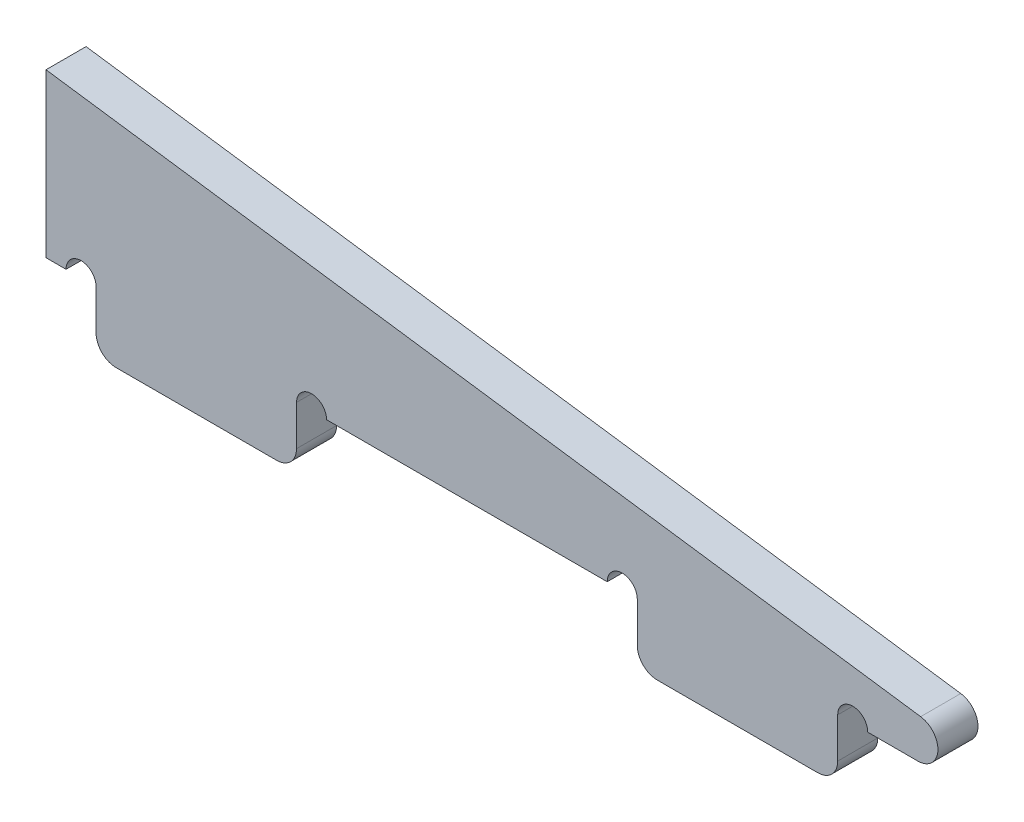
ISO-10303-21;
HEADER;
FILE_DESCRIPTION(('STEP AP214'),'2;1');
FILE_NAME('part.step','',(''),(''),'','','');
FILE_SCHEMA(('AUTOMOTIVE_DESIGN { 1 0 10303 214 1 1 1 1 }'));
ENDSEC;
DATA;
#1=APPLICATION_CONTEXT('core data for automotive mechanical design processes');
#2=APPLICATION_PROTOCOL_DEFINITION('international standard','automotive_design',2000,#1);
#3=PRODUCT_CONTEXT('',#1,'mechanical');
#4=PRODUCT('Part','Part','',(#3));
#5=PRODUCT_RELATED_PRODUCT_CATEGORY('part','',(#4));
#6=PRODUCT_DEFINITION_FORMATION('','',#4);
#7=PRODUCT_DEFINITION_CONTEXT('part definition',#1,'design');
#8=PRODUCT_DEFINITION('design','',#6,#7);
#9=PRODUCT_DEFINITION_SHAPE('','',#8);
#10=(LENGTH_UNIT() NAMED_UNIT(*) SI_UNIT(.MILLI.,.METRE.));
#11=(NAMED_UNIT(*) PLANE_ANGLE_UNIT() SI_UNIT($,.RADIAN.));
#12=(NAMED_UNIT(*) SI_UNIT($,.STERADIAN.) SOLID_ANGLE_UNIT());
#13=UNCERTAINTY_MEASURE_WITH_UNIT(LENGTH_MEASURE(1.E-05),#10,'distance_accuracy_value','');
#14=(GEOMETRIC_REPRESENTATION_CONTEXT(3) GLOBAL_UNCERTAINTY_ASSIGNED_CONTEXT((#13)) GLOBAL_UNIT_ASSIGNED_CONTEXT((#10,
#11,#12)) REPRESENTATION_CONTEXT('',''));
#15=CARTESIAN_POINT('',(0.,0.,0.));
#16=DIRECTION('',(0.,0.,1.));
#17=DIRECTION('',(1.,0.,0.));
#18=AXIS2_PLACEMENT_3D('',#15,#16,#17);
#19=CARTESIAN_POINT('',(0.,0.,2.));
#20=DIRECTION('',(0.,1.,0.));
#21=DIRECTION('',(0.,0.,1.));
#22=AXIS2_PLACEMENT_3D('',#19,#20,#21);
#23=PLANE('',#22);
#24=DIRECTION('',(1.,0.,0.));
#25=VECTOR('',#24,1.);
#26=CARTESIAN_POINT('',(0.,0.,2.));
#27=LINE('',#26,#25);
#28=CARTESIAN_POINT('',(1.5,0.,2.));
#29=VERTEX_POINT('',#28);
#30=CARTESIAN_POINT('',(4.,0.,2.));
#31=VERTEX_POINT('',#30);
#32=EDGE_CURVE('E208',#29,#31,#27,.T.);
#33=ORIENTED_EDGE('',*,*,#32,.F.);
#34=DIRECTION('',(0.,0.,1.));
#35=VECTOR('',#34,1.);
#36=CARTESIAN_POINT('',(1.5,0.,0.));
#37=LINE('',#36,#35);
#38=CARTESIAN_POINT('',(1.5,0.,0.));
#39=VERTEX_POINT('',#38);
#40=EDGE_CURVE('E193',#29,#39,#37,.F.);
#41=ORIENTED_EDGE('',*,*,#40,.T.);
#42=DIRECTION('',(1.,0.,0.));
#43=VECTOR('',#42,1.);
#44=CARTESIAN_POINT('',(0.,0.,0.));
#45=LINE('',#44,#43);
#46=CARTESIAN_POINT('',(4.,0.,0.));
#47=VERTEX_POINT('',#46);
#48=EDGE_CURVE('E206',#39,#47,#45,.T.);
#49=ORIENTED_EDGE('',*,*,#48,.T.);
#50=DIRECTION('',(0.,0.,-1.));
#51=VECTOR('',#50,1.);
#52=CARTESIAN_POINT('',(4.,0.,2.));
#53=LINE('',#52,#51);
#54=EDGE_CURVE('E270',#31,#47,#53,.T.);
#55=ORIENTED_EDGE('',*,*,#54,.F.);
#56=EDGE_LOOP('',(#33,#41,#49,#55));
#57=FACE_BOUND('',#56,.T.);
#58=ADVANCED_FACE('F50',(#57),#23,.F.);
#59=CARTESIAN_POINT('',(4.,1.,2.));
#60=DIRECTION('',(0.,0.,-1.));
#61=DIRECTION('',(-1.,0.,0.));
#62=AXIS2_PLACEMENT_3D('',#59,#60,#61);
#63=CYLINDRICAL_SURFACE('',#62,1.);
#64=CARTESIAN_POINT('',(4.,1.,0.));
#65=DIRECTION('',(0.,0.,1.));
#66=DIRECTION('',(1.,0.,0.));
#67=AXIS2_PLACEMENT_3D('',#64,#65,#66);
#68=CIRCLE('',#67,1.);
#69=CARTESIAN_POINT('',(4.13917310096006,1.99026806874157,0.));
#70=VERTEX_POINT('',#69);
#71=EDGE_CURVE('E214',#47,#70,#68,.T.);
#72=ORIENTED_EDGE('',*,*,#71,.T.);
#73=DIRECTION('',(0.,0.,-1.));
#74=VECTOR('',#73,1.);
#75=CARTESIAN_POINT('',(4.13917310096006,1.99026806874157,2.));
#76=LINE('',#75,#74);
#77=CARTESIAN_POINT('',(4.13917310096006,1.99026806874157,2.));
#78=VERTEX_POINT('',#77);
#79=EDGE_CURVE('E267',#78,#70,#76,.T.);
#80=ORIENTED_EDGE('',*,*,#79,.F.);
#81=CARTESIAN_POINT('',(4.,1.,2.));
#82=DIRECTION('',(0.,0.,1.));
#83=DIRECTION('',(1.,0.,0.));
#84=AXIS2_PLACEMENT_3D('',#81,#82,#83);
#85=CIRCLE('',#84,1.);
#86=EDGE_CURVE('E344',#31,#78,#85,.T.);
#87=ORIENTED_EDGE('',*,*,#86,.F.);
#88=ORIENTED_EDGE('',*,*,#54,.T.);
#89=EDGE_LOOP('',(#72,#80,#87,#88));
#90=FACE_BOUND('',#89,.T.);
#91=ADVANCED_FACE('F388',(#90),#63,.T.);
#92=CARTESIAN_POINT('',(4.13917310096006,1.99026806874157,2.));
#93=DIRECTION('',(-0.139173100960059,-0.990268068741571,0.));
#94=DIRECTION('',(0.990268068741571,-0.139173100960059,0.));
#95=AXIS2_PLACEMENT_3D('',#92,#93,#94);
#96=PLANE('',#95);
#97=DIRECTION('',(-0.990268068741571,0.139173100960058,0.));
#98=VECTOR('',#97,1.);
#99=CARTESIAN_POINT('',(4.13917310096006,1.99026806874157,0.));
#100=LINE('',#99,#98);
#101=CARTESIAN_POINT('',(-39.5,8.12335388207233,0.));
#102=VERTEX_POINT('',#101);
#103=EDGE_CURVE('E218',#70,#102,#100,.T.);
#104=ORIENTED_EDGE('',*,*,#103,.T.);
#105=DIRECTION('',(0.,0.,-1.));
#106=VECTOR('',#105,1.);
#107=CARTESIAN_POINT('',(-39.5,8.12335388207233,2.));
#108=LINE('',#107,#106);
#109=CARTESIAN_POINT('',(-39.5,8.12335388207233,2.));
#110=VERTEX_POINT('',#109);
#111=EDGE_CURVE('E264',#110,#102,#108,.T.);
#112=ORIENTED_EDGE('',*,*,#111,.F.);
#113=DIRECTION('',(-0.990268068741571,0.139173100960058,0.));
#114=VECTOR('',#113,1.);
#115=CARTESIAN_POINT('',(4.13917310096006,1.99026806874157,2.));
#116=LINE('',#115,#114);
#117=EDGE_CURVE('E346',#78,#110,#116,.T.);
#118=ORIENTED_EDGE('',*,*,#117,.F.);
#119=ORIENTED_EDGE('',*,*,#79,.T.);
#120=EDGE_LOOP('',(#104,#112,#118,#119));
#121=FACE_BOUND('',#120,.T.);
#122=ADVANCED_FACE('F392',(#121),#96,.F.);
#123=CARTESIAN_POINT('',(-39.5,8.12335388207233,2.));
#124=DIRECTION('',(1.,0.,0.));
#125=DIRECTION('',(0.,0.,-1.));
#126=AXIS2_PLACEMENT_3D('',#123,#124,#125);
#127=PLANE('',#126);
#128=DIRECTION('',(0.,-1.,0.));
#129=VECTOR('',#128,1.);
#130=CARTESIAN_POINT('',(-39.5,8.12335388207233,0.));
#131=LINE('',#130,#129);
#132=CARTESIAN_POINT('',(-39.5,0.,0.));
#133=VERTEX_POINT('',#132);
#134=EDGE_CURVE('E228',#102,#133,#131,.T.);
#135=ORIENTED_EDGE('',*,*,#134,.T.);
#136=DIRECTION('',(0.,0.,-1.));
#137=VECTOR('',#136,1.);
#138=CARTESIAN_POINT('',(-39.5,0.,2.));
#139=LINE('',#138,#137);
#140=CARTESIAN_POINT('',(-39.5,0.,2.));
#141=VERTEX_POINT('',#140);
#142=EDGE_CURVE('E261',#141,#133,#139,.T.);
#143=ORIENTED_EDGE('',*,*,#142,.F.);
#144=DIRECTION('',(0.,-1.,0.));
#145=VECTOR('',#144,1.);
#146=CARTESIAN_POINT('',(-39.5,8.12335388207233,2.));
#147=LINE('',#146,#145);
#148=EDGE_CURVE('E348',#110,#141,#147,.T.);
#149=ORIENTED_EDGE('',*,*,#148,.F.);
#150=ORIENTED_EDGE('',*,*,#111,.T.);
#151=EDGE_LOOP('',(#135,#143,#149,#150));
#152=FACE_BOUND('',#151,.T.);
#153=ADVANCED_FACE('F398',(#152),#127,.F.);
#154=CARTESIAN_POINT('',(-39.5,0.,2.));
#155=DIRECTION('',(0.,1.,0.));
#156=DIRECTION('',(0.,0.,1.));
#157=AXIS2_PLACEMENT_3D('',#154,#155,#156);
#158=PLANE('',#157);
#159=DIRECTION('',(1.,0.,0.));
#160=VECTOR('',#159,1.);
#161=CARTESIAN_POINT('',(-39.5,0.,0.));
#162=LINE('',#161,#160);
#163=CARTESIAN_POINT('',(-38.5,0.,0.));
#164=VERTEX_POINT('',#163);
#165=EDGE_CURVE('E230',#133,#164,#162,.T.);
#166=ORIENTED_EDGE('',*,*,#165,.T.);
#167=DIRECTION('',(0.,0.,1.));
#168=VECTOR('',#167,1.);
#169=CARTESIAN_POINT('',(-38.5,0.,0.));
#170=LINE('',#169,#168);
#171=CARTESIAN_POINT('',(-38.5,0.,2.));
#172=VERTEX_POINT('',#171);
#173=EDGE_CURVE('E216',#164,#172,#170,.T.);
#174=ORIENTED_EDGE('',*,*,#173,.T.);
#175=DIRECTION('',(1.,0.,0.));
#176=VECTOR('',#175,1.);
#177=CARTESIAN_POINT('',(-39.5,0.,2.));
#178=LINE('',#177,#176);
#179=EDGE_CURVE('E350',#141,#172,#178,.T.);
#180=ORIENTED_EDGE('',*,*,#179,.F.);
#181=ORIENTED_EDGE('',*,*,#142,.T.);
#182=EDGE_LOOP('',(#166,#174,#180,#181));
#183=FACE_BOUND('',#182,.T.);
#184=ADVANCED_FACE('F402',(#183),#158,.F.);
#185=CARTESIAN_POINT('',(-37.,0.,2.));
#186=DIRECTION('',(1.,0.,0.));
#187=DIRECTION('',(0.,0.,-1.));
#188=AXIS2_PLACEMENT_3D('',#185,#186,#187);
#189=PLANE('',#188);
#190=DIRECTION('',(0.,-1.,0.));
#191=VECTOR('',#190,1.);
#192=CARTESIAN_POINT('',(-37.,0.,0.));
#193=LINE('',#192,#191);
#194=CARTESIAN_POINT('',(-37.,0.,0.));
#195=VERTEX_POINT('',#194);
#196=CARTESIAN_POINT('',(-37.,-2.,0.));
#197=VERTEX_POINT('',#196);
#198=EDGE_CURVE('E233',#195,#197,#193,.T.);
#199=ORIENTED_EDGE('',*,*,#198,.T.);
#200=DIRECTION('',(0.,0.,-1.));
#201=VECTOR('',#200,1.);
#202=CARTESIAN_POINT('',(-37.,-2.,2.));
#203=LINE('',#202,#201);
#204=CARTESIAN_POINT('',(-37.,-2.,2.));
#205=VERTEX_POINT('',#204);
#206=EDGE_CURVE('E13',#197,#205,#203,.F.);
#207=ORIENTED_EDGE('',*,*,#206,.T.);
#208=DIRECTION('',(0.,-1.,0.));
#209=VECTOR('',#208,1.);
#210=CARTESIAN_POINT('',(-37.,0.,2.));
#211=LINE('',#210,#209);
#212=CARTESIAN_POINT('',(-37.,0.,2.));
#213=VERTEX_POINT('',#212);
#214=EDGE_CURVE('E314',#213,#205,#211,.T.);
#215=ORIENTED_EDGE('',*,*,#214,.F.);
#216=DIRECTION('',(0.,0.,-1.));
#217=VECTOR('',#216,1.);
#218=CARTESIAN_POINT('',(-37.,0.,2.));
#219=LINE('',#218,#217);
#220=EDGE_CURVE('E258',#213,#195,#219,.T.);
#221=ORIENTED_EDGE('',*,*,#220,.T.);
#222=EDGE_LOOP('',(#199,#207,#215,#221));
#223=FACE_BOUND('',#222,.T.);
#224=ADVANCED_FACE('F406',(#223),#189,.F.);
#225=CARTESIAN_POINT('',(-37.,-3.,2.));
#226=DIRECTION('',(0.,1.,0.));
#227=DIRECTION('',(0.,0.,1.));
#228=AXIS2_PLACEMENT_3D('',#225,#226,#227);
#229=PLANE('',#228);
#230=DIRECTION('',(1.,0.,0.));
#231=VECTOR('',#230,1.);
#232=CARTESIAN_POINT('',(-37.,-3.,0.));
#233=LINE('',#232,#231);
#234=CARTESIAN_POINT('',(-36.,-3.,0.));
#235=VERTEX_POINT('',#234);
#236=CARTESIAN_POINT('',(-28.,-3.,0.));
#237=VERTEX_POINT('',#236);
#238=EDGE_CURVE('E236',#235,#237,#233,.T.);
#239=ORIENTED_EDGE('',*,*,#238,.T.);
#240=DIRECTION('',(0.,0.,-1.));
#241=VECTOR('',#240,1.);
#242=CARTESIAN_POINT('',(-28.,-3.,2.));
#243=LINE('',#242,#241);
#244=CARTESIAN_POINT('',(-28.,-3.,2.));
#245=VERTEX_POINT('',#244);
#246=EDGE_CURVE('E58',#237,#245,#243,.F.);
#247=ORIENTED_EDGE('',*,*,#246,.T.);
#248=DIRECTION('',(1.,0.,0.));
#249=VECTOR('',#248,1.);
#250=CARTESIAN_POINT('',(-37.,-3.,2.));
#251=LINE('',#250,#249);
#252=CARTESIAN_POINT('',(-36.,-3.,2.));
#253=VERTEX_POINT('',#252);
#254=EDGE_CURVE('E305',#253,#245,#251,.T.);
#255=ORIENTED_EDGE('',*,*,#254,.F.);
#256=DIRECTION('',(0.,0.,-1.));
#257=VECTOR('',#256,1.);
#258=CARTESIAN_POINT('',(-36.,-3.,2.));
#259=LINE('',#258,#257);
#260=EDGE_CURVE('E299',#253,#235,#259,.T.);
#261=ORIENTED_EDGE('',*,*,#260,.T.);
#262=EDGE_LOOP('',(#239,#247,#255,#261));
#263=FACE_BOUND('',#262,.T.);
#264=ADVANCED_FACE('F304',(#263),#229,.F.);
#265=CARTESIAN_POINT('',(-27.,-3.,2.));
#266=DIRECTION('',(-1.,0.,0.));
#267=DIRECTION('',(0.,0.,1.));
#268=AXIS2_PLACEMENT_3D('',#265,#266,#267);
#269=PLANE('',#268);
#270=DIRECTION('',(0.,1.,0.));
#271=VECTOR('',#270,1.);
#272=CARTESIAN_POINT('',(-27.,-3.,2.));
#273=LINE('',#272,#271);
#274=CARTESIAN_POINT('',(-27.,-2.,2.));
#275=VERTEX_POINT('',#274);
#276=CARTESIAN_POINT('',(-27.,0.,2.));
#277=VERTEX_POINT('',#276);
#278=EDGE_CURVE('E313',#275,#277,#273,.T.);
#279=ORIENTED_EDGE('',*,*,#278,.F.);
#280=DIRECTION('',(0.,0.,-1.));
#281=VECTOR('',#280,1.);
#282=CARTESIAN_POINT('',(-27.,-2.,2.));
#283=LINE('',#282,#281);
#284=CARTESIAN_POINT('',(-27.,-2.,0.));
#285=VERTEX_POINT('',#284);
#286=EDGE_CURVE('E296',#275,#285,#283,.T.);
#287=ORIENTED_EDGE('',*,*,#286,.T.);
#288=DIRECTION('',(0.,1.,0.));
#289=VECTOR('',#288,1.);
#290=CARTESIAN_POINT('',(-27.,-3.,0.));
#291=LINE('',#290,#289);
#292=CARTESIAN_POINT('',(-27.,0.,0.));
#293=VERTEX_POINT('',#292);
#294=EDGE_CURVE('E239',#285,#293,#291,.T.);
#295=ORIENTED_EDGE('',*,*,#294,.T.);
#296=DIRECTION('',(0.,0.,-1.));
#297=VECTOR('',#296,1.);
#298=CARTESIAN_POINT('',(-27.,0.,2.));
#299=LINE('',#298,#297);
#300=EDGE_CURVE('E255',#277,#293,#299,.T.);
#301=ORIENTED_EDGE('',*,*,#300,.F.);
#302=EDGE_LOOP('',(#279,#287,#295,#301));
#303=FACE_BOUND('',#302,.T.);
#304=ADVANCED_FACE('F320',(#303),#269,.F.);
#305=CARTESIAN_POINT('',(-27.,0.,2.));
#306=DIRECTION('',(0.,1.,0.));
#307=DIRECTION('',(0.,0.,1.));
#308=AXIS2_PLACEMENT_3D('',#305,#306,#307);
#309=PLANE('',#308);
#310=DIRECTION('',(1.,0.,0.));
#311=VECTOR('',#310,1.);
#312=CARTESIAN_POINT('',(-27.,0.,2.));
#313=LINE('',#312,#311);
#314=CARTESIAN_POINT('',(-25.5,0.,2.));
#315=VERTEX_POINT('',#314);
#316=CARTESIAN_POINT('',(-11.5,0.,2.));
#317=VERTEX_POINT('',#316);
#318=EDGE_CURVE('E355',#315,#317,#313,.T.);
#319=ORIENTED_EDGE('',*,*,#318,.F.);
#320=DIRECTION('',(0.,0.,1.));
#321=VECTOR('',#320,1.);
#322=CARTESIAN_POINT('',(-25.5,0.,0.));
#323=LINE('',#322,#321);
#324=CARTESIAN_POINT('',(-25.5,0.,0.));
#325=VERTEX_POINT('',#324);
#326=EDGE_CURVE('E221',#315,#325,#323,.F.);
#327=ORIENTED_EDGE('',*,*,#326,.T.);
#328=DIRECTION('',(1.,0.,0.));
#329=VECTOR('',#328,1.);
#330=CARTESIAN_POINT('',(-27.,0.,0.));
#331=LINE('',#330,#329);
#332=CARTESIAN_POINT('',(-11.5,0.,0.));
#333=VERTEX_POINT('',#332);
#334=EDGE_CURVE('E241',#325,#333,#331,.T.);
#335=ORIENTED_EDGE('',*,*,#334,.T.);
#336=DIRECTION('',(0.,0.,1.));
#337=VECTOR('',#336,1.);
#338=CARTESIAN_POINT('',(-11.5,0.,0.));
#339=LINE('',#338,#337);
#340=EDGE_CURVE('E209',#333,#317,#339,.T.);
#341=ORIENTED_EDGE('',*,*,#340,.T.);
#342=EDGE_LOOP('',(#319,#327,#335,#341));
#343=FACE_BOUND('',#342,.T.);
#344=ADVANCED_FACE('F415',(#343),#309,.F.);
#345=CARTESIAN_POINT('',(-10.,0.,2.));
#346=DIRECTION('',(1.,0.,0.));
#347=DIRECTION('',(0.,0.,-1.));
#348=AXIS2_PLACEMENT_3D('',#345,#346,#347);
#349=PLANE('',#348);
#350=DIRECTION('',(0.,-1.,0.));
#351=VECTOR('',#350,1.);
#352=CARTESIAN_POINT('',(-10.,0.,0.));
#353=LINE('',#352,#351);
#354=CARTESIAN_POINT('',(-10.,0.,0.));
#355=VERTEX_POINT('',#354);
#356=CARTESIAN_POINT('',(-10.,-2.,0.));
#357=VERTEX_POINT('',#356);
#358=EDGE_CURVE('E244',#355,#357,#353,.T.);
#359=ORIENTED_EDGE('',*,*,#358,.T.);
#360=DIRECTION('',(0.,0.,-1.));
#361=VECTOR('',#360,1.);
#362=CARTESIAN_POINT('',(-10.,-2.,2.));
#363=LINE('',#362,#361);
#364=CARTESIAN_POINT('',(-10.,-2.,2.));
#365=VERTEX_POINT('',#364);
#366=EDGE_CURVE('E65',#357,#365,#363,.F.);
#367=ORIENTED_EDGE('',*,*,#366,.T.);
#368=DIRECTION('',(0.,-1.,0.));
#369=VECTOR('',#368,1.);
#370=CARTESIAN_POINT('',(-10.,0.,2.));
#371=LINE('',#370,#369);
#372=CARTESIAN_POINT('',(-10.,0.,2.));
#373=VERTEX_POINT('',#372);
#374=EDGE_CURVE('E358',#373,#365,#371,.T.);
#375=ORIENTED_EDGE('',*,*,#374,.F.);
#376=DIRECTION('',(0.,0.,-1.));
#377=VECTOR('',#376,1.);
#378=CARTESIAN_POINT('',(-10.,0.,2.));
#379=LINE('',#378,#377);
#380=EDGE_CURVE('E252',#373,#355,#379,.T.);
#381=ORIENTED_EDGE('',*,*,#380,.T.);
#382=EDGE_LOOP('',(#359,#367,#375,#381));
#383=FACE_BOUND('',#382,.T.);
#384=ADVANCED_FACE('F418',(#383),#349,.F.);
#385=CARTESIAN_POINT('',(-10.,-3.,2.));
#386=DIRECTION('',(0.,1.,0.));
#387=DIRECTION('',(0.,0.,1.));
#388=AXIS2_PLACEMENT_3D('',#385,#386,#387);
#389=PLANE('',#388);
#390=DIRECTION('',(1.,0.,0.));
#391=VECTOR('',#390,1.);
#392=CARTESIAN_POINT('',(-10.,-3.,0.));
#393=LINE('',#392,#391);
#394=CARTESIAN_POINT('',(-9.,-3.,0.));
#395=VERTEX_POINT('',#394);
#396=CARTESIAN_POINT('',(-0.999999999999999,-3.,0.));
#397=VERTEX_POINT('',#396);
#398=EDGE_CURVE('E246',#395,#397,#393,.T.);
#399=ORIENTED_EDGE('',*,*,#398,.T.);
#400=DIRECTION('',(0.,0.,-1.));
#401=VECTOR('',#400,1.);
#402=CARTESIAN_POINT('',(-0.999999999999999,-3.,2.));
#403=LINE('',#402,#401);
#404=CARTESIAN_POINT('',(-0.999999999999999,-3.,2.));
#405=VERTEX_POINT('',#404);
#406=EDGE_CURVE('E286',#397,#405,#403,.F.);
#407=ORIENTED_EDGE('',*,*,#406,.T.);
#408=DIRECTION('',(1.,0.,0.));
#409=VECTOR('',#408,1.);
#410=CARTESIAN_POINT('',(-10.,-3.,2.));
#411=LINE('',#410,#409);
#412=CARTESIAN_POINT('',(-9.,-3.,2.));
#413=VERTEX_POINT('',#412);
#414=EDGE_CURVE('E359',#413,#405,#411,.T.);
#415=ORIENTED_EDGE('',*,*,#414,.F.);
#416=DIRECTION('',(0.,0.,-1.));
#417=VECTOR('',#416,1.);
#418=CARTESIAN_POINT('',(-9.,-3.,2.));
#419=LINE('',#418,#417);
#420=EDGE_CURVE('E283',#413,#395,#419,.T.);
#421=ORIENTED_EDGE('',*,*,#420,.T.);
#422=EDGE_LOOP('',(#399,#407,#415,#421));
#423=FACE_BOUND('',#422,.T.);
#424=ADVANCED_FACE('F370',(#423),#389,.F.);
#425=CARTESIAN_POINT('',(0.,-3.,2.));
#426=DIRECTION('',(-1.,0.,0.));
#427=DIRECTION('',(0.,0.,1.));
#428=AXIS2_PLACEMENT_3D('',#425,#426,#427);
#429=PLANE('',#428);
#430=DIRECTION('',(0.,1.,0.));
#431=VECTOR('',#430,1.);
#432=CARTESIAN_POINT('',(0.,-3.,2.));
#433=LINE('',#432,#431);
#434=CARTESIAN_POINT('',(0.,-2.,2.));
#435=VERTEX_POINT('',#434);
#436=CARTESIAN_POINT('',(0.,0.,2.));
#437=VERTEX_POINT('',#436);
#438=EDGE_CURVE('E224',#435,#437,#433,.T.);
#439=ORIENTED_EDGE('',*,*,#438,.F.);
#440=DIRECTION('',(0.,0.,-1.));
#441=VECTOR('',#440,1.);
#442=CARTESIAN_POINT('',(0.,-2.,2.));
#443=LINE('',#442,#441);
#444=CARTESIAN_POINT('',(0.,-2.,0.));
#445=VERTEX_POINT('',#444);
#446=EDGE_CURVE('E272',#435,#445,#443,.T.);
#447=ORIENTED_EDGE('',*,*,#446,.T.);
#448=DIRECTION('',(0.,1.,0.));
#449=VECTOR('',#448,1.);
#450=CARTESIAN_POINT('',(0.,-3.,0.));
#451=LINE('',#450,#449);
#452=CARTESIAN_POINT('',(0.,0.,0.));
#453=VERTEX_POINT('',#452);
#454=EDGE_CURVE('E249',#445,#453,#451,.T.);
#455=ORIENTED_EDGE('',*,*,#454,.T.);
#456=DIRECTION('',(0.,0.,-1.));
#457=VECTOR('',#456,1.);
#458=CARTESIAN_POINT('',(0.,0.,2.));
#459=LINE('',#458,#457);
#460=EDGE_CURVE('E196',#437,#453,#459,.T.);
#461=ORIENTED_EDGE('',*,*,#460,.F.);
#462=EDGE_LOOP('',(#439,#447,#455,#461));
#463=FACE_BOUND('',#462,.T.);
#464=ADVANCED_FACE('F365',(#463),#429,.F.);
#465=CARTESIAN_POINT('',(4.,1.,2.));
#466=DIRECTION('',(0.,0.,1.));
#467=DIRECTION('',(1.,0.,0.));
#468=AXIS2_PLACEMENT_3D('',#465,#466,#467);
#469=PLANE('',#468);
#470=ORIENTED_EDGE('',*,*,#414,.T.);
#471=CARTESIAN_POINT('',(-1.,-2.,2.));
#472=DIRECTION('',(0.,0.,1.));
#473=DIRECTION('',(1.,0.,0.));
#474=AXIS2_PLACEMENT_3D('',#471,#472,#473);
#475=CIRCLE('',#474,1.);
#476=EDGE_CURVE('E293',#405,#435,#475,.T.);
#477=ORIENTED_EDGE('',*,*,#476,.T.);
#478=ORIENTED_EDGE('',*,*,#438,.T.);
#479=CARTESIAN_POINT('',(0.75,0.,2.));
#480=DIRECTION('',(0.,0.,1.));
#481=DIRECTION('',(1.,0.,0.));
#482=AXIS2_PLACEMENT_3D('',#479,#480,#481);
#483=CIRCLE('',#482,0.75);
#484=EDGE_CURVE('E201',#29,#437,#483,.T.);
#485=ORIENTED_EDGE('',*,*,#484,.F.);
#486=ORIENTED_EDGE('',*,*,#32,.T.);
#487=ORIENTED_EDGE('',*,*,#86,.T.);
#488=ORIENTED_EDGE('',*,*,#117,.T.);
#489=ORIENTED_EDGE('',*,*,#148,.T.);
#490=ORIENTED_EDGE('',*,*,#179,.T.);
#491=CARTESIAN_POINT('',(-37.75,0.,2.));
#492=DIRECTION('',(0.,0.,1.));
#493=DIRECTION('',(1.,0.,0.));
#494=AXIS2_PLACEMENT_3D('',#491,#492,#493);
#495=CIRCLE('',#494,0.749999999999999);
#496=EDGE_CURVE('E328',#213,#172,#495,.T.);
#497=ORIENTED_EDGE('',*,*,#496,.F.);
#498=ORIENTED_EDGE('',*,*,#214,.T.);
#499=CARTESIAN_POINT('',(-36.,-2.,2.));
#500=DIRECTION('',(0.,0.,1.));
#501=DIRECTION('',(1.,0.,0.));
#502=AXIS2_PLACEMENT_3D('',#499,#500,#501);
#503=CIRCLE('',#502,1.);
#504=EDGE_CURVE('E288',#205,#253,#503,.T.);
#505=ORIENTED_EDGE('',*,*,#504,.T.);
#506=ORIENTED_EDGE('',*,*,#254,.T.);
#507=CARTESIAN_POINT('',(-28.,-2.,2.));
#508=DIRECTION('',(0.,0.,1.));
#509=DIRECTION('',(1.,0.,0.));
#510=AXIS2_PLACEMENT_3D('',#507,#508,#509);
#511=CIRCLE('',#510,1.);
#512=EDGE_CURVE('E73',#245,#275,#511,.T.);
#513=ORIENTED_EDGE('',*,*,#512,.T.);
#514=ORIENTED_EDGE('',*,*,#278,.T.);
#515=CARTESIAN_POINT('',(-26.25,0.,2.));
#516=DIRECTION('',(0.,0.,1.));
#517=DIRECTION('',(1.,0.,0.));
#518=AXIS2_PLACEMENT_3D('',#515,#516,#517);
#519=CIRCLE('',#518,0.750000000000002);
#520=EDGE_CURVE('E329',#315,#277,#519,.T.);
#521=ORIENTED_EDGE('',*,*,#520,.F.);
#522=ORIENTED_EDGE('',*,*,#318,.T.);
#523=CARTESIAN_POINT('',(-10.75,0.,2.));
#524=DIRECTION('',(0.,0.,1.));
#525=DIRECTION('',(1.,0.,0.));
#526=AXIS2_PLACEMENT_3D('',#523,#524,#525);
#527=CIRCLE('',#526,0.75);
#528=EDGE_CURVE('E200',#373,#317,#527,.T.);
#529=ORIENTED_EDGE('',*,*,#528,.F.);
#530=ORIENTED_EDGE('',*,*,#374,.T.);
#531=CARTESIAN_POINT('',(-9.,-2.,2.));
#532=DIRECTION('',(0.,0.,1.));
#533=DIRECTION('',(1.,0.,0.));
#534=AXIS2_PLACEMENT_3D('',#531,#532,#533);
#535=CIRCLE('',#534,1.);
#536=EDGE_CURVE('E291',#365,#413,#535,.T.);
#537=ORIENTED_EDGE('',*,*,#536,.T.);
#538=EDGE_LOOP('',(#470,#477,#478,#485,#486,#487,#488,#489,#490,#497,#498,#505,#506,#513,#514,
#521,#522,#529,#530,#537));
#539=FACE_BOUND('',#538,.T.);
#540=ADVANCED_FACE('F310',(#539),#469,.T.);
#541=CARTESIAN_POINT('',(4.,1.,0.));
#542=DIRECTION('',(0.,0.,1.));
#543=DIRECTION('',(1.,0.,0.));
#544=AXIS2_PLACEMENT_3D('',#541,#542,#543);
#545=PLANE('',#544);
#546=ORIENTED_EDGE('',*,*,#454,.F.);
#547=CARTESIAN_POINT('',(-1.,-2.,0.));
#548=DIRECTION('',(0.,0.,1.));
#549=DIRECTION('',(1.,0.,0.));
#550=AXIS2_PLACEMENT_3D('',#547,#548,#549);
#551=CIRCLE('',#550,1.);
#552=EDGE_CURVE('E281',#445,#397,#551,.F.);
#553=ORIENTED_EDGE('',*,*,#552,.T.);
#554=ORIENTED_EDGE('',*,*,#398,.F.);
#555=CARTESIAN_POINT('',(-9.,-2.,0.));
#556=DIRECTION('',(0.,0.,1.));
#557=DIRECTION('',(1.,0.,0.));
#558=AXIS2_PLACEMENT_3D('',#555,#556,#557);
#559=CIRCLE('',#558,1.);
#560=EDGE_CURVE('E279',#395,#357,#559,.F.);
#561=ORIENTED_EDGE('',*,*,#560,.T.);
#562=ORIENTED_EDGE('',*,*,#358,.F.);
#563=CARTESIAN_POINT('',(-10.75,0.,0.));
#564=DIRECTION('',(0.,0.,1.));
#565=DIRECTION('',(1.,0.,0.));
#566=AXIS2_PLACEMENT_3D('',#563,#564,#565);
#567=CIRCLE('',#566,0.75);
#568=EDGE_CURVE('E333',#355,#333,#567,.T.);
#569=ORIENTED_EDGE('',*,*,#568,.T.);
#570=ORIENTED_EDGE('',*,*,#334,.F.);
#571=CARTESIAN_POINT('',(-26.25,0.,0.));
#572=DIRECTION('',(0.,0.,1.));
#573=DIRECTION('',(1.,0.,0.));
#574=AXIS2_PLACEMENT_3D('',#571,#572,#573);
#575=CIRCLE('',#574,0.750000000000002);
#576=EDGE_CURVE('E324',#325,#293,#575,.T.);
#577=ORIENTED_EDGE('',*,*,#576,.T.);
#578=ORIENTED_EDGE('',*,*,#294,.F.);
#579=CARTESIAN_POINT('',(-28.,-2.,0.));
#580=DIRECTION('',(0.,0.,1.));
#581=DIRECTION('',(1.,0.,0.));
#582=AXIS2_PLACEMENT_3D('',#579,#580,#581);
#583=CIRCLE('',#582,1.);
#584=EDGE_CURVE('E277',#285,#237,#583,.F.);
#585=ORIENTED_EDGE('',*,*,#584,.T.);
#586=ORIENTED_EDGE('',*,*,#238,.F.);
#587=CARTESIAN_POINT('',(-36.,-2.,0.));
#588=DIRECTION('',(0.,0.,1.));
#589=DIRECTION('',(1.,0.,0.));
#590=AXIS2_PLACEMENT_3D('',#587,#588,#589);
#591=CIRCLE('',#590,1.);
#592=EDGE_CURVE('E275',#235,#197,#591,.F.);
#593=ORIENTED_EDGE('',*,*,#592,.T.);
#594=ORIENTED_EDGE('',*,*,#198,.F.);
#595=CARTESIAN_POINT('',(-37.75,0.,0.));
#596=DIRECTION('',(0.,0.,1.));
#597=DIRECTION('',(1.,0.,0.));
#598=AXIS2_PLACEMENT_3D('',#595,#596,#597);
#599=CIRCLE('',#598,0.749999999999999);
#600=EDGE_CURVE('E210',#195,#164,#599,.T.);
#601=ORIENTED_EDGE('',*,*,#600,.T.);
#602=ORIENTED_EDGE('',*,*,#165,.F.);
#603=ORIENTED_EDGE('',*,*,#134,.F.);
#604=ORIENTED_EDGE('',*,*,#103,.F.);
#605=ORIENTED_EDGE('',*,*,#71,.F.);
#606=ORIENTED_EDGE('',*,*,#48,.F.);
#607=CARTESIAN_POINT('',(0.75,0.,0.));
#608=DIRECTION('',(0.,0.,1.));
#609=DIRECTION('',(1.,0.,0.));
#610=AXIS2_PLACEMENT_3D('',#607,#608,#609);
#611=CIRCLE('',#610,0.75);
#612=EDGE_CURVE('E189',#39,#453,#611,.T.);
#613=ORIENTED_EDGE('',*,*,#612,.T.);
#614=EDGE_LOOP('',(#546,#553,#554,#561,#562,#569,#570,#577,#578,#585,#586,#593,#594,#601,#602,
#603,#604,#605,#606,#613));
#615=FACE_BOUND('',#614,.T.);
#616=ADVANCED_FACE('F212',(#615),#545,.F.);
#617=CARTESIAN_POINT('',(0.75,0.,0.));
#618=DIRECTION('',(0.,0.,1.));
#619=DIRECTION('',(1.,0.,0.));
#620=AXIS2_PLACEMENT_3D('',#617,#618,#619);
#621=CYLINDRICAL_SURFACE('',#620,0.75);
#622=ORIENTED_EDGE('',*,*,#484,.T.);
#623=ORIENTED_EDGE('',*,*,#460,.T.);
#624=ORIENTED_EDGE('',*,*,#612,.F.);
#625=ORIENTED_EDGE('',*,*,#40,.F.);
#626=EDGE_LOOP('',(#622,#623,#624,#625));
#627=FACE_BOUND('',#626,.T.);
#628=ADVANCED_FACE('F192',(#627),#621,.F.);
#629=CARTESIAN_POINT('',(-10.75,0.,0.));
#630=DIRECTION('',(0.,0.,1.));
#631=DIRECTION('',(1.,0.,0.));
#632=AXIS2_PLACEMENT_3D('',#629,#630,#631);
#633=CYLINDRICAL_SURFACE('',#632,0.75);
#634=ORIENTED_EDGE('',*,*,#568,.F.);
#635=ORIENTED_EDGE('',*,*,#380,.F.);
#636=ORIENTED_EDGE('',*,*,#528,.T.);
#637=ORIENTED_EDGE('',*,*,#340,.F.);
#638=EDGE_LOOP('',(#634,#635,#636,#637));
#639=FACE_BOUND('',#638,.T.);
#640=ADVANCED_FACE('F432',(#639),#633,.F.);
#641=CARTESIAN_POINT('',(-26.25,0.,0.));
#642=DIRECTION('',(0.,0.,1.));
#643=DIRECTION('',(1.,0.,0.));
#644=AXIS2_PLACEMENT_3D('',#641,#642,#643);
#645=CYLINDRICAL_SURFACE('',#644,0.750000000000002);
#646=ORIENTED_EDGE('',*,*,#576,.F.);
#647=ORIENTED_EDGE('',*,*,#326,.F.);
#648=ORIENTED_EDGE('',*,*,#520,.T.);
#649=ORIENTED_EDGE('',*,*,#300,.T.);
#650=EDGE_LOOP('',(#646,#647,#648,#649));
#651=FACE_BOUND('',#650,.T.);
#652=ADVANCED_FACE('F383',(#651),#645,.F.);
#653=CARTESIAN_POINT('',(-37.75,0.,0.));
#654=DIRECTION('',(0.,0.,1.));
#655=DIRECTION('',(1.,0.,0.));
#656=AXIS2_PLACEMENT_3D('',#653,#654,#655);
#657=CYLINDRICAL_SURFACE('',#656,0.749999999999999);
#658=ORIENTED_EDGE('',*,*,#600,.F.);
#659=ORIENTED_EDGE('',*,*,#220,.F.);
#660=ORIENTED_EDGE('',*,*,#496,.T.);
#661=ORIENTED_EDGE('',*,*,#173,.F.);
#662=EDGE_LOOP('',(#658,#659,#660,#661));
#663=FACE_BOUND('',#662,.T.);
#664=ADVANCED_FACE('F375',(#663),#657,.F.);
#665=CARTESIAN_POINT('',(-1.,-2.,2.));
#666=DIRECTION('',(0.,0.,-1.));
#667=DIRECTION('',(-1.,0.,0.));
#668=AXIS2_PLACEMENT_3D('',#665,#666,#667);
#669=CYLINDRICAL_SURFACE('',#668,1.);
#670=ORIENTED_EDGE('',*,*,#476,.F.);
#671=ORIENTED_EDGE('',*,*,#406,.F.);
#672=ORIENTED_EDGE('',*,*,#552,.F.);
#673=ORIENTED_EDGE('',*,*,#446,.F.);
#674=EDGE_LOOP('',(#670,#671,#672,#673));
#675=FACE_BOUND('',#674,.T.);
#676=ADVANCED_FACE('F372',(#675),#669,.T.);
#677=CARTESIAN_POINT('',(-9.,-2.,2.));
#678=DIRECTION('',(0.,0.,-1.));
#679=DIRECTION('',(-1.,0.,0.));
#680=AXIS2_PLACEMENT_3D('',#677,#678,#679);
#681=CYLINDRICAL_SURFACE('',#680,1.);
#682=ORIENTED_EDGE('',*,*,#536,.F.);
#683=ORIENTED_EDGE('',*,*,#366,.F.);
#684=ORIENTED_EDGE('',*,*,#560,.F.);
#685=ORIENTED_EDGE('',*,*,#420,.F.);
#686=EDGE_LOOP('',(#682,#683,#684,#685));
#687=FACE_BOUND('',#686,.T.);
#688=ADVANCED_FACE('F374',(#687),#681,.T.);
#689=CARTESIAN_POINT('',(-28.,-2.,2.));
#690=DIRECTION('',(0.,0.,-1.));
#691=DIRECTION('',(-1.,0.,0.));
#692=AXIS2_PLACEMENT_3D('',#689,#690,#691);
#693=CYLINDRICAL_SURFACE('',#692,1.);
#694=ORIENTED_EDGE('',*,*,#512,.F.);
#695=ORIENTED_EDGE('',*,*,#246,.F.);
#696=ORIENTED_EDGE('',*,*,#584,.F.);
#697=ORIENTED_EDGE('',*,*,#286,.F.);
#698=EDGE_LOOP('',(#694,#695,#696,#697));
#699=FACE_BOUND('',#698,.T.);
#700=ADVANCED_FACE('F317',(#699),#693,.T.);
#701=CARTESIAN_POINT('',(-36.,-2.,2.));
#702=DIRECTION('',(0.,0.,-1.));
#703=DIRECTION('',(-1.,0.,0.));
#704=AXIS2_PLACEMENT_3D('',#701,#702,#703);
#705=CYLINDRICAL_SURFACE('',#704,1.);
#706=ORIENTED_EDGE('',*,*,#504,.F.);
#707=ORIENTED_EDGE('',*,*,#206,.F.);
#708=ORIENTED_EDGE('',*,*,#592,.F.);
#709=ORIENTED_EDGE('',*,*,#260,.F.);
#710=EDGE_LOOP('',(#706,#707,#708,#709));
#711=FACE_BOUND('',#710,.T.);
#712=ADVANCED_FACE('F52',(#711),#705,.T.);
#713=CLOSED_SHELL('',(#58,#91,#122,#153,#184,#224,#264,#304,#344,#384,#424,#464,#540,#616,#628,
#640,#652,#664,#676,#688,#700,#712));
#714=MANIFOLD_SOLID_BREP('B2',#713);
#715=ADVANCED_BREP_SHAPE_REPRESENTATION('',(#18,#714),#14);
#716=SHAPE_DEFINITION_REPRESENTATION(#9,#715);
ENDSEC;
END-ISO-10303-21;
